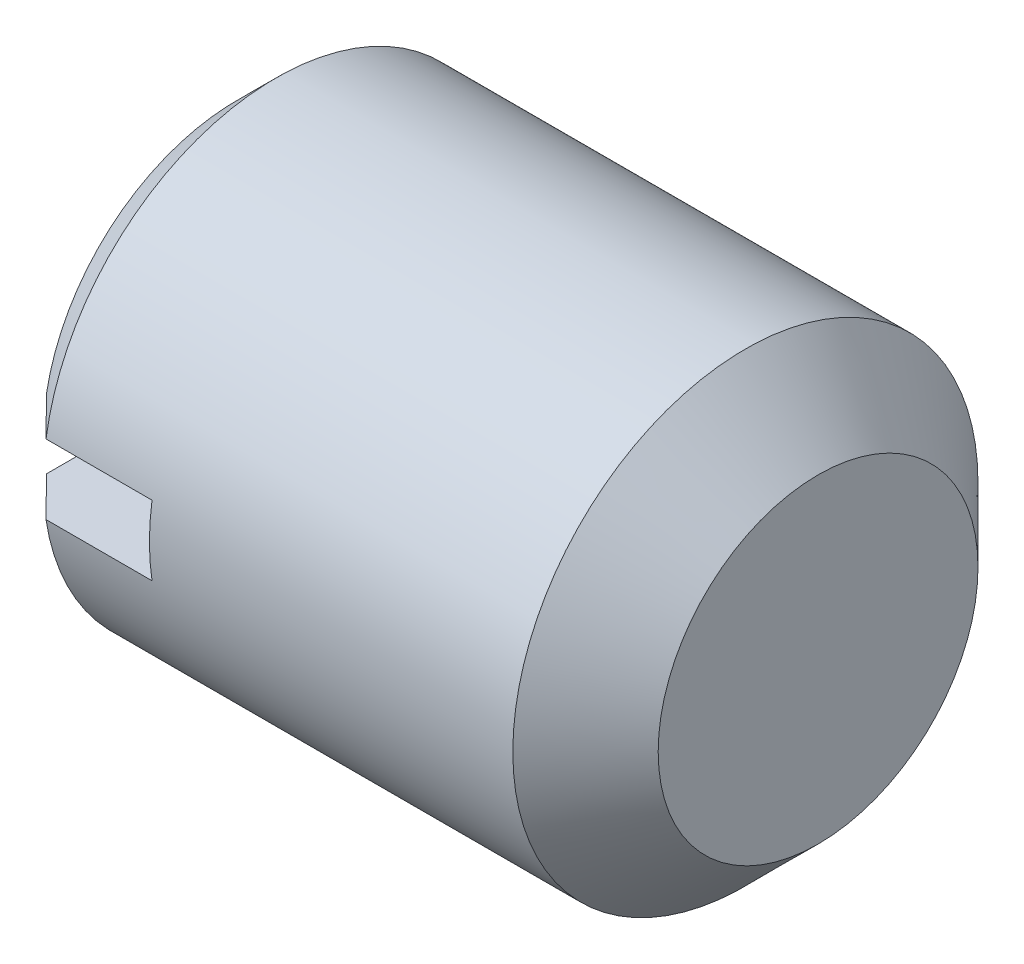
ISO-10303-21;
HEADER;
FILE_DESCRIPTION(('STEP AP214'),'2;1');
FILE_NAME('part.step','',(''),(''),'','','');
FILE_SCHEMA(('AUTOMOTIVE_DESIGN { 1 0 10303 214 1 1 1 1 }'));
ENDSEC;
DATA;
#1=APPLICATION_CONTEXT('core data for automotive mechanical design processes');
#2=APPLICATION_PROTOCOL_DEFINITION('international standard','automotive_design',2000,#1);
#3=PRODUCT_CONTEXT('',#1,'mechanical');
#4=PRODUCT('Part','Part','',(#3));
#5=PRODUCT_RELATED_PRODUCT_CATEGORY('part','',(#4));
#6=PRODUCT_DEFINITION_FORMATION('','',#4);
#7=PRODUCT_DEFINITION_CONTEXT('part definition',#1,'design');
#8=PRODUCT_DEFINITION('design','',#6,#7);
#9=PRODUCT_DEFINITION_SHAPE('','',#8);
#10=(LENGTH_UNIT() NAMED_UNIT(*) SI_UNIT(.MILLI.,.METRE.));
#11=(NAMED_UNIT(*) PLANE_ANGLE_UNIT() SI_UNIT($,.RADIAN.));
#12=(NAMED_UNIT(*) SI_UNIT($,.STERADIAN.) SOLID_ANGLE_UNIT());
#13=UNCERTAINTY_MEASURE_WITH_UNIT(LENGTH_MEASURE(1.E-05),#10,'distance_accuracy_value','');
#14=(GEOMETRIC_REPRESENTATION_CONTEXT(3) GLOBAL_UNCERTAINTY_ASSIGNED_CONTEXT((#13)) GLOBAL_UNIT_ASSIGNED_CONTEXT((#10,
#11,#12)) REPRESENTATION_CONTEXT('',''));
#15=CARTESIAN_POINT('',(0.,0.,0.));
#16=DIRECTION('',(0.,0.,1.));
#17=DIRECTION('',(1.,0.,0.));
#18=AXIS2_PLACEMENT_3D('',#15,#16,#17);
#19=CARTESIAN_POINT('',(10.,0.,0.));
#20=DIRECTION('',(1.,0.,0.));
#21=DIRECTION('',(0.,0.,-1.));
#22=AXIS2_PLACEMENT_3D('',#19,#20,#21);
#23=PLANE('',#22);
#24=CARTESIAN_POINT('',(10.0000000000477,0.,0.));
#25=DIRECTION('',(-1.,0.,0.));
#26=DIRECTION('',(0.,0.,1.));
#27=AXIS2_PLACEMENT_3D('',#24,#25,#26);
#28=CIRCLE('',#27,2.74999999993497);
#29=CARTESIAN_POINT('',(10.0000000000477,0.,2.74999999993497));
#30=VERTEX_POINT('',#29);
#31=EDGE_CURVE('E146',#30,#30,#28,.T.);
#32=ORIENTED_EDGE('',*,*,#31,.F.);
#33=EDGE_LOOP('',(#32));
#34=FACE_BOUND('',#33,.T.);
#35=ADVANCED_FACE('F16',(#34),#23,.T.);
#36=CARTESIAN_POINT('',(0.,0.,0.));
#37=DIRECTION('',(-1.,0.,0.));
#38=DIRECTION('',(0.,0.,1.));
#39=AXIS2_PLACEMENT_3D('',#36,#37,#38);
#40=PLANE('',#39);
#41=DIRECTION('',(0.,0.,-1.));
#42=VECTOR('',#41,1.);
#43=CARTESIAN_POINT('',(0.,-0.6,-4.));
#44=LINE('',#43,#42);
#45=CARTESIAN_POINT('',(1.13504679613799E-11,-0.6,3.26880787106049));
#46=VERTEX_POINT('',#45);
#47=CARTESIAN_POINT('',(0.,-0.6,-3.26880787104895));
#48=VERTEX_POINT('',#47);
#49=EDGE_CURVE('E102',#46,#48,#44,.T.);
#50=ORIENTED_EDGE('',*,*,#49,.T.);
#51=CARTESIAN_POINT('',(0.,0.,0.));
#52=DIRECTION('',(1.,0.,0.));
#53=DIRECTION('',(0.,0.,-1.));
#54=AXIS2_PLACEMENT_3D('',#51,#52,#53);
#55=CIRCLE('',#54,3.32341765323463);
#56=EDGE_CURVE('E143',#46,#48,#55,.T.);
#57=ORIENTED_EDGE('',*,*,#56,.F.);
#58=EDGE_LOOP('',(#50,#57));
#59=FACE_BOUND('',#58,.T.);
#60=ADVANCED_FACE('F154',(#59),#40,.T.);
#61=CARTESIAN_POINT('',(0.,0.,0.));
#62=DIRECTION('',(-1.,0.,0.));
#63=DIRECTION('',(0.,0.,1.));
#64=AXIS2_PLACEMENT_3D('',#61,#62,#63);
#65=PLANE('',#64);
#66=DIRECTION('',(0.,0.,1.));
#67=VECTOR('',#66,1.);
#68=CARTESIAN_POINT('',(0.,0.6,-4.));
#69=LINE('',#68,#67);
#70=CARTESIAN_POINT('',(1.13503023775339E-11,0.6,-3.26880787106049));
#71=VERTEX_POINT('',#70);
#72=CARTESIAN_POINT('',(0.,0.6,3.26880787104895));
#73=VERTEX_POINT('',#72);
#74=EDGE_CURVE('E93',#71,#73,#69,.T.);
#75=ORIENTED_EDGE('',*,*,#74,.T.);
#76=CARTESIAN_POINT('',(0.,0.,0.));
#77=DIRECTION('',(1.,0.,0.));
#78=DIRECTION('',(0.,0.,-1.));
#79=AXIS2_PLACEMENT_3D('',#76,#77,#78);
#80=CIRCLE('',#79,3.32341765323463);
#81=EDGE_CURVE('E96',#71,#73,#80,.T.);
#82=ORIENTED_EDGE('',*,*,#81,.F.);
#83=EDGE_LOOP('',(#75,#82));
#84=FACE_BOUND('',#83,.T.);
#85=ADVANCED_FACE('F156',(#84),#65,.T.);
#86=CARTESIAN_POINT('',(2.5,-0.6,-4.));
#87=DIRECTION('',(1.,0.,0.));
#88=DIRECTION('',(0.,0.,-1.));
#89=AXIS2_PLACEMENT_3D('',#86,#87,#88);
#90=PLANE('',#89);
#91=DIRECTION('',(0.,0.,1.));
#92=VECTOR('',#91,1.);
#93=CARTESIAN_POINT('',(2.5,0.6,-4.));
#94=LINE('',#93,#92);
#95=CARTESIAN_POINT('',(2.5,0.6,3.95474398665704));
#96=VERTEX_POINT('',#95);
#97=CARTESIAN_POINT('',(2.5,0.6,-3.95474398665704));
#98=VERTEX_POINT('',#97);
#99=EDGE_CURVE('E77',#96,#98,#94,.F.);
#100=ORIENTED_EDGE('',*,*,#99,.T.);
#101=CARTESIAN_POINT('',(2.5,0.,0.));
#102=DIRECTION('',(1.,0.,0.));
#103=DIRECTION('',(0.,0.,-1.));
#104=AXIS2_PLACEMENT_3D('',#101,#102,#103);
#105=CIRCLE('',#104,4.);
#106=CARTESIAN_POINT('',(2.5,-0.600000000000001,-3.95474398665704));
#107=VERTEX_POINT('',#106);
#108=EDGE_CURVE('E19',#107,#98,#105,.T.);
#109=ORIENTED_EDGE('',*,*,#108,.F.);
#110=DIRECTION('',(0.,0.,-1.));
#111=VECTOR('',#110,1.);
#112=CARTESIAN_POINT('',(2.5,-0.6,-4.));
#113=LINE('',#112,#111);
#114=CARTESIAN_POINT('',(2.5,-0.6,3.95474398665704));
#115=VERTEX_POINT('',#114);
#116=EDGE_CURVE('E95',#107,#115,#113,.F.);
#117=ORIENTED_EDGE('',*,*,#116,.T.);
#118=CARTESIAN_POINT('',(2.5,0.,0.));
#119=DIRECTION('',(1.,0.,0.));
#120=DIRECTION('',(0.,0.,-1.));
#121=AXIS2_PLACEMENT_3D('',#118,#119,#120);
#122=CIRCLE('',#121,4.);
#123=EDGE_CURVE('E75',#96,#115,#122,.T.);
#124=ORIENTED_EDGE('',*,*,#123,.F.);
#125=EDGE_LOOP('',(#100,#109,#117,#124));
#126=FACE_BOUND('',#125,.T.);
#127=ADVANCED_FACE('F78',(#126),#90,.F.);
#128=CARTESIAN_POINT('',(8.75000000007731,0.,0.));
#129=DIRECTION('',(-1.,0.,0.));
#130=DIRECTION('',(0.,0.,1.));
#131=AXIS2_PLACEMENT_3D('',#128,#129,#130);
#132=CONICAL_SURFACE('',#131,3.99999999990541,0.785398163397448);
#133=CARTESIAN_POINT('',(8.75,0.,0.));
#134=DIRECTION('',(1.,0.,0.));
#135=DIRECTION('',(0.,0.,-1.));
#136=AXIS2_PLACEMENT_3D('',#133,#134,#135);
#137=CIRCLE('',#136,4.);
#138=CARTESIAN_POINT('',(8.75,0.,-4.));
#139=VERTEX_POINT('',#138);
#140=EDGE_CURVE('E81',#139,#139,#137,.F.);
#141=ORIENTED_EDGE('',*,*,#140,.F.);
#142=EDGE_LOOP('',(#141));
#143=FACE_BOUND('',#142,.T.);
#144=ORIENTED_EDGE('',*,*,#31,.T.);
#145=EDGE_LOOP('',(#144));
#146=FACE_BOUND('',#145,.T.);
#147=ADVANCED_FACE('F187',(#143,#146),#132,.T.);
#148=CARTESIAN_POINT('',(0.676582345704446,0.,0.));
#149=DIRECTION('',(1.,0.,0.));
#150=DIRECTION('',(0.,0.,-1.));
#151=AXIS2_PLACEMENT_3D('',#148,#149,#150);
#152=CONICAL_SURFACE('',#151,4.0000000000191,0.785398164195596);
#153=CARTESIAN_POINT('',(0.676582345680582,-0.6,3.95474398665222));
#154=CARTESIAN_POINT('',(0.563671612492779,-0.6,3.84056631356184));
#155=CARTESIAN_POINT('',(0.450834385911616,-0.6,3.72631613623788));
#156=CARTESIAN_POINT('',(0.225306937347757,-0.6,3.49767076438889));
#157=CARTESIAN_POINT('',(0.112616715376294,-0.6,3.38327556985279));
#158=CARTESIAN_POINT('',(2.27008211706176E-11,-0.6,3.26880787107203));
#159=B_SPLINE_CURVE_WITH_KNOTS('',3,(#153,#154,#155,#156,#157,#158),.UNSPECIFIED.,.F.,.F.,(4,2,
4),(0.,0.481734454331186,0.963468945465437),.UNSPECIFIED.);
#160=CARTESIAN_POINT('',(0.676582345673361,-0.6,3.95474398665463));
#161=VERTEX_POINT('',#160);
#162=EDGE_CURVE('E104',#161,#46,#159,.T.);
#163=ORIENTED_EDGE('',*,*,#162,.T.);
#164=ORIENTED_EDGE('',*,*,#56,.T.);
#165=CARTESIAN_POINT('',(1.45396306395373E-11,-0.6,-3.26880787106373));
#166=CARTESIAN_POINT('',(0.112616715370275,-0.6,-3.38327556984668));
#167=CARTESIAN_POINT('',(0.225306937343884,-0.6,-3.49767076438496));
#168=CARTESIAN_POINT('',(0.450834385912039,-0.6,-3.72631613623831));
#169=CARTESIAN_POINT('',(0.563671612495354,-0.6,-3.84056631356445));
#170=CARTESIAN_POINT('',(0.676582345685311,-0.6,-3.954743986657));
#171=B_SPLINE_CURVE_WITH_KNOTS('',3,(#165,#166,#167,#168,#169,#170),.UNSPECIFIED.,.F.,.F.,(4,2,
4),(0.,0.481734491143433,0.963468945483801),.UNSPECIFIED.);
#172=CARTESIAN_POINT('',(0.676582345675725,-0.600000000000001,-3.95474398665702));
#173=VERTEX_POINT('',#172);
#174=EDGE_CURVE('E97',#48,#173,#171,.T.);
#175=ORIENTED_EDGE('',*,*,#174,.T.);
#176=CARTESIAN_POINT('',(0.67658234566614,0.,0.));
#177=DIRECTION('',(1.,0.,0.));
#178=DIRECTION('',(0.,0.,-1.));
#179=AXIS2_PLACEMENT_3D('',#176,#177,#178);
#180=CIRCLE('',#179,4.);
#181=EDGE_CURVE('E90',#161,#173,#180,.T.);
#182=ORIENTED_EDGE('',*,*,#181,.F.);
#183=EDGE_LOOP('',(#163,#164,#175,#182));
#184=FACE_BOUND('',#183,.T.);
#185=ADVANCED_FACE('F128',(#184),#152,.T.);
#186=CARTESIAN_POINT('',(0.,-0.6,-4.));
#187=DIRECTION('',(0.,-1.,0.));
#188=DIRECTION('',(0.,0.,-1.));
#189=AXIS2_PLACEMENT_3D('',#186,#187,#188);
#190=PLANE('',#189);
#191=ORIENTED_EDGE('',*,*,#116,.F.);
#192=DIRECTION('',(1.,0.,0.));
#193=VECTOR('',#192,1.);
#194=CARTESIAN_POINT('',(0.67658234566614,-0.600000000000002,-3.95474398665704));
#195=LINE('',#194,#193);
#196=EDGE_CURVE('E74',#173,#107,#195,.T.);
#197=ORIENTED_EDGE('',*,*,#196,.F.);
#198=ORIENTED_EDGE('',*,*,#174,.F.);
#199=ORIENTED_EDGE('',*,*,#49,.F.);
#200=ORIENTED_EDGE('',*,*,#162,.F.);
#201=DIRECTION('',(1.,0.,0.));
#202=VECTOR('',#201,1.);
#203=CARTESIAN_POINT('',(0.67658234566614,-0.599999999999999,3.95474398665704));
#204=LINE('',#203,#202);
#205=EDGE_CURVE('E99',#115,#161,#204,.F.);
#206=ORIENTED_EDGE('',*,*,#205,.F.);
#207=EDGE_LOOP('',(#191,#197,#198,#199,#200,#206));
#208=FACE_BOUND('',#207,.T.);
#209=ADVANCED_FACE('F122',(#208),#190,.F.);
#210=CARTESIAN_POINT('',(0.676582345704446,0.,0.));
#211=DIRECTION('',(1.,0.,0.));
#212=DIRECTION('',(0.,0.,-1.));
#213=AXIS2_PLACEMENT_3D('',#210,#211,#212);
#214=CONICAL_SURFACE('',#213,4.0000000000191,0.785398164195596);
#215=CARTESIAN_POINT('',(0.676582345680582,0.6,-3.95474398665222));
#216=CARTESIAN_POINT('',(0.563671612492779,0.6,-3.84056631356184));
#217=CARTESIAN_POINT('',(0.450834385911616,0.6,-3.72631613623788));
#218=CARTESIAN_POINT('',(0.225306937347757,0.6,-3.49767076438889));
#219=CARTESIAN_POINT('',(0.112616715376294,0.6,-3.38327556985279));
#220=CARTESIAN_POINT('',(2.27004734429981E-11,0.6,-3.26880787107203));
#221=B_SPLINE_CURVE_WITH_KNOTS('',3,(#215,#216,#217,#218,#219,#220),.UNSPECIFIED.,.F.,.F.,(4,2,
4),(0.,0.481734454331186,0.963468945465437),.UNSPECIFIED.);
#222=CARTESIAN_POINT('',(0.676582345673361,0.6,-3.95474398665463));
#223=VERTEX_POINT('',#222);
#224=EDGE_CURVE('E87',#223,#71,#221,.T.);
#225=ORIENTED_EDGE('',*,*,#224,.T.);
#226=ORIENTED_EDGE('',*,*,#81,.T.);
#227=CARTESIAN_POINT('',(1.45396397155953E-11,0.6,3.26880787106373));
#228=CARTESIAN_POINT('',(0.112616715370275,0.6,3.38327556984668));
#229=CARTESIAN_POINT('',(0.225306937343884,0.6,3.49767076438496));
#230=CARTESIAN_POINT('',(0.450834385912039,0.6,3.72631613623831));
#231=CARTESIAN_POINT('',(0.563671612495354,0.6,3.84056631356445));
#232=CARTESIAN_POINT('',(0.676582345685311,0.6,3.954743986657));
#233=B_SPLINE_CURVE_WITH_KNOTS('',3,(#227,#228,#229,#230,#231,#232),.UNSPECIFIED.,.F.,.F.,(4,2,
4),(0.,0.481734491143433,0.963468945483802),.UNSPECIFIED.);
#234=CARTESIAN_POINT('',(0.676582345675725,0.6,3.95474398665702));
#235=VERTEX_POINT('',#234);
#236=EDGE_CURVE('E82',#73,#235,#233,.T.);
#237=ORIENTED_EDGE('',*,*,#236,.T.);
#238=CARTESIAN_POINT('',(0.67658234566614,0.,0.));
#239=DIRECTION('',(1.,0.,0.));
#240=DIRECTION('',(0.,0.,-1.));
#241=AXIS2_PLACEMENT_3D('',#238,#239,#240);
#242=CIRCLE('',#241,4.);
#243=EDGE_CURVE('E25',#223,#235,#242,.T.);
#244=ORIENTED_EDGE('',*,*,#243,.F.);
#245=EDGE_LOOP('',(#225,#226,#237,#244));
#246=FACE_BOUND('',#245,.T.);
#247=ADVANCED_FACE('F118',(#246),#214,.T.);
#248=CARTESIAN_POINT('',(2.5,0.6,-4.));
#249=DIRECTION('',(0.,1.,0.));
#250=DIRECTION('',(0.,0.,1.));
#251=AXIS2_PLACEMENT_3D('',#248,#249,#250);
#252=PLANE('',#251);
#253=ORIENTED_EDGE('',*,*,#99,.F.);
#254=DIRECTION('',(1.,0.,0.));
#255=VECTOR('',#254,1.);
#256=CARTESIAN_POINT('',(0.67658234566614,0.6,3.95474398665704));
#257=LINE('',#256,#255);
#258=EDGE_CURVE('E11',#235,#96,#257,.T.);
#259=ORIENTED_EDGE('',*,*,#258,.F.);
#260=ORIENTED_EDGE('',*,*,#236,.F.);
#261=ORIENTED_EDGE('',*,*,#74,.F.);
#262=ORIENTED_EDGE('',*,*,#224,.F.);
#263=DIRECTION('',(1.,0.,0.));
#264=VECTOR('',#263,1.);
#265=CARTESIAN_POINT('',(0.67658234566614,0.6,-3.95474398665704));
#266=LINE('',#265,#264);
#267=EDGE_CURVE('E71',#98,#223,#266,.F.);
#268=ORIENTED_EDGE('',*,*,#267,.F.);
#269=EDGE_LOOP('',(#253,#259,#260,#261,#262,#268));
#270=FACE_BOUND('',#269,.T.);
#271=ADVANCED_FACE('F84',(#270),#252,.F.);
#272=CARTESIAN_POINT('',(0.67658234566614,0.,0.));
#273=DIRECTION('',(1.,0.,0.));
#274=DIRECTION('',(0.,0.,-1.));
#275=AXIS2_PLACEMENT_3D('',#272,#273,#274);
#276=CYLINDRICAL_SURFACE('',#275,4.);
#277=ORIENTED_EDGE('',*,*,#243,.T.);
#278=ORIENTED_EDGE('',*,*,#258,.T.);
#279=ORIENTED_EDGE('',*,*,#123,.T.);
#280=ORIENTED_EDGE('',*,*,#205,.T.);
#281=ORIENTED_EDGE('',*,*,#181,.T.);
#282=ORIENTED_EDGE('',*,*,#196,.T.);
#283=ORIENTED_EDGE('',*,*,#108,.T.);
#284=ORIENTED_EDGE('',*,*,#267,.T.);
#285=EDGE_LOOP('',(#277,#278,#279,#280,#281,#282,#283,#284));
#286=FACE_BOUND('',#285,.T.);
#287=ORIENTED_EDGE('',*,*,#140,.T.);
#288=EDGE_LOOP('',(#287));
#289=FACE_BOUND('',#288,.T.);
#290=ADVANCED_FACE('F68',(#286,#289),#276,.T.);
#291=CLOSED_SHELL('',(#35,#60,#85,#127,#147,#185,#209,#247,#271,#290));
#292=MANIFOLD_SOLID_BREP('B1',#291);
#293=ADVANCED_BREP_SHAPE_REPRESENTATION('',(#18,#292),#14);
#294=SHAPE_DEFINITION_REPRESENTATION(#9,#293);
ENDSEC;
END-ISO-10303-21;
